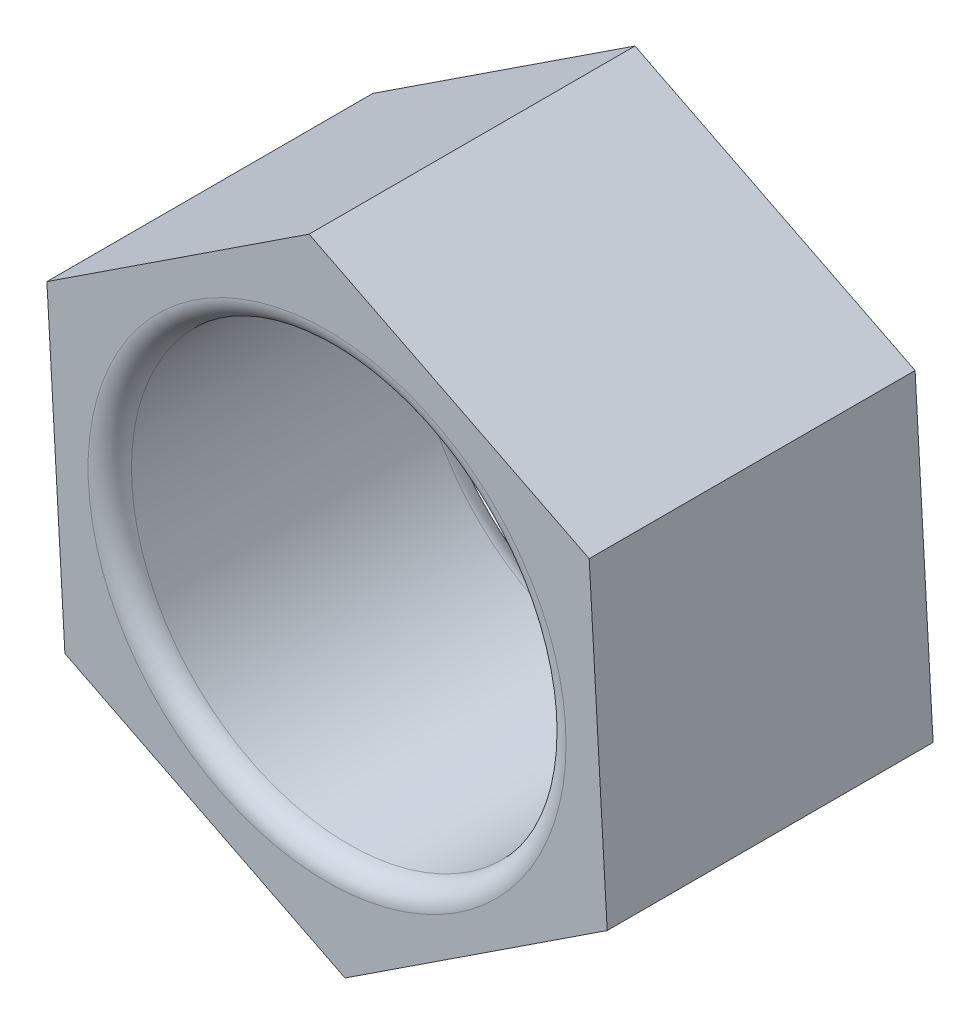
ISO-10303-21;
HEADER;
FILE_DESCRIPTION(('STEP AP214'),'2;1');
FILE_NAME('part.step','',(''),(''),'','','');
FILE_SCHEMA(('AUTOMOTIVE_DESIGN { 1 0 10303 214 1 1 1 1 }'));
ENDSEC;
DATA;
#1=APPLICATION_CONTEXT('core data for automotive mechanical design processes');
#2=APPLICATION_PROTOCOL_DEFINITION('international standard','automotive_design',2000,#1);
#3=PRODUCT_CONTEXT('',#1,'mechanical');
#4=PRODUCT('Part','Part','',(#3));
#5=PRODUCT_RELATED_PRODUCT_CATEGORY('part','',(#4));
#6=PRODUCT_DEFINITION_FORMATION('','',#4);
#7=PRODUCT_DEFINITION_CONTEXT('part definition',#1,'design');
#8=PRODUCT_DEFINITION('design','',#6,#7);
#9=PRODUCT_DEFINITION_SHAPE('','',#8);
#10=(LENGTH_UNIT() NAMED_UNIT(*) SI_UNIT(.MILLI.,.METRE.));
#11=(NAMED_UNIT(*) PLANE_ANGLE_UNIT() SI_UNIT($,.RADIAN.));
#12=(NAMED_UNIT(*) SI_UNIT($,.STERADIAN.) SOLID_ANGLE_UNIT());
#13=UNCERTAINTY_MEASURE_WITH_UNIT(LENGTH_MEASURE(1.E-05),#10,'distance_accuracy_value','');
#14=(GEOMETRIC_REPRESENTATION_CONTEXT(3) GLOBAL_UNCERTAINTY_ASSIGNED_CONTEXT((#13)) GLOBAL_UNIT_ASSIGNED_CONTEXT((#10,
#11,#12)) REPRESENTATION_CONTEXT('',''));
#15=CARTESIAN_POINT('',(0.,0.,0.));
#16=DIRECTION('',(0.,0.,1.));
#17=DIRECTION('',(1.,0.,0.));
#18=AXIS2_PLACEMENT_3D('',#15,#16,#17);
#19=CARTESIAN_POINT('',(1.20650377619789,0.792263826861706,1.5));
#20=DIRECTION('',(-0.449454025494052,-0.893303464096716,0.));
#21=DIRECTION('',(0.893303464096716,-0.449454025494052,0.));
#22=AXIS2_PLACEMENT_3D('',#19,#20,#21);
#23=PLANE('',#22);
#24=DIRECTION('',(-0.893303464096716,0.449454025494052,0.));
#25=VECTOR('',#24,1.);
#26=CARTESIAN_POINT('',(1.20650377619789,0.792263826861706,0.));
#27=LINE('',#26,#25);
#28=CARTESIAN_POINT('',(1.20650377619789,0.792263826861706,0.));
#29=VERTEX_POINT('',#28);
#30=CARTESIAN_POINT('',(-0.0828687124627659,1.44099483338009,0.));
#31=VERTEX_POINT('',#30);
#32=EDGE_CURVE('E120',#29,#31,#27,.T.);
#33=ORIENTED_EDGE('',*,*,#32,.T.);
#34=DIRECTION('',(0.,0.,-1.));
#35=VECTOR('',#34,1.);
#36=CARTESIAN_POINT('',(-0.0828687124627659,1.44099483338009,1.5));
#37=LINE('',#36,#35);
#38=CARTESIAN_POINT('',(-0.0828687124627659,1.44099483338009,1.5));
#39=VERTEX_POINT('',#38);
#40=EDGE_CURVE('E137',#39,#31,#37,.T.);
#41=ORIENTED_EDGE('',*,*,#40,.F.);
#42=DIRECTION('',(-0.893303464096716,0.449454025494052,0.));
#43=VECTOR('',#42,1.);
#44=CARTESIAN_POINT('',(1.20650377619789,0.792263826861706,1.5));
#45=LINE('',#44,#43);
#46=CARTESIAN_POINT('',(1.20650377619789,0.792263826861706,1.5));
#47=VERTEX_POINT('',#46);
#48=EDGE_CURVE('E130',#47,#39,#45,.T.);
#49=ORIENTED_EDGE('',*,*,#48,.F.);
#50=DIRECTION('',(0.,0.,-1.));
#51=VECTOR('',#50,1.);
#52=CARTESIAN_POINT('',(1.20650377619789,0.792263826861706,1.5));
#53=LINE('',#52,#51);
#54=EDGE_CURVE('E116',#47,#29,#53,.T.);
#55=ORIENTED_EDGE('',*,*,#54,.T.);
#56=EDGE_LOOP('',(#33,#41,#49,#55));
#57=FACE_BOUND('',#56,.T.);
#58=ADVANCED_FACE('F34',(#57),#23,.F.);
#59=CARTESIAN_POINT('',(-0.0828687124627659,1.44099483338009,1.5));
#60=DIRECTION('',(0.548896480449371,-0.835890335959385,0.));
#61=DIRECTION('',(0.835890335959385,0.548896480449371,0.));
#62=AXIS2_PLACEMENT_3D('',#59,#60,#61);
#63=PLANE('',#62);
#64=DIRECTION('',(-0.835890335959385,-0.548896480449371,0.));
#65=VECTOR('',#64,1.);
#66=CARTESIAN_POINT('',(-0.0828687124627659,1.44099483338009,0.));
#67=LINE('',#66,#65);
#68=CARTESIAN_POINT('',(-1.28937248866066,0.648731006518379,0.));
#69=VERTEX_POINT('',#68);
#70=EDGE_CURVE('E123',#31,#69,#67,.T.);
#71=ORIENTED_EDGE('',*,*,#70,.T.);
#72=DIRECTION('',(0.,0.,-1.));
#73=VECTOR('',#72,1.);
#74=CARTESIAN_POINT('',(-1.28937248866066,0.648731006518379,1.5));
#75=LINE('',#74,#73);
#76=CARTESIAN_POINT('',(-1.28937248866066,0.648731006518379,1.5));
#77=VERTEX_POINT('',#76);
#78=EDGE_CURVE('E134',#77,#69,#75,.T.);
#79=ORIENTED_EDGE('',*,*,#78,.F.);
#80=DIRECTION('',(-0.835890335959385,-0.548896480449371,0.));
#81=VECTOR('',#80,1.);
#82=CARTESIAN_POINT('',(-0.0828687124627659,1.44099483338009,1.5));
#83=LINE('',#82,#81);
#84=EDGE_CURVE('E89',#39,#77,#83,.T.);
#85=ORIENTED_EDGE('',*,*,#84,.F.);
#86=ORIENTED_EDGE('',*,*,#40,.T.);
#87=EDGE_LOOP('',(#71,#79,#85,#86));
#88=FACE_BOUND('',#87,.T.);
#89=ADVANCED_FACE('F176',(#88),#63,.F.);
#90=CARTESIAN_POINT('',(-1.28937248866066,0.648731006518379,1.5));
#91=DIRECTION('',(0.998350505943422,0.0574131281373304,0.));
#92=DIRECTION('',(-0.0574131281373304,0.998350505943422,0.));
#93=AXIS2_PLACEMENT_3D('',#90,#91,#92);
#94=PLANE('',#93);
#95=DIRECTION('',(0.0574131281373304,-0.998350505943422,0.));
#96=VECTOR('',#95,1.);
#97=CARTESIAN_POINT('',(-1.28937248866066,0.648731006518379,0.));
#98=LINE('',#97,#96);
#99=CARTESIAN_POINT('',(-1.2065037761979,-0.792263826861706,0.));
#100=VERTEX_POINT('',#99);
#101=EDGE_CURVE('E125',#69,#100,#98,.T.);
#102=ORIENTED_EDGE('',*,*,#101,.T.);
#103=DIRECTION('',(0.,0.,-1.));
#104=VECTOR('',#103,1.);
#105=CARTESIAN_POINT('',(-1.2065037761979,-0.792263826861706,1.5));
#106=LINE('',#105,#104);
#107=CARTESIAN_POINT('',(-1.2065037761979,-0.792263826861706,1.5));
#108=VERTEX_POINT('',#107);
#109=EDGE_CURVE('E111',#108,#100,#106,.T.);
#110=ORIENTED_EDGE('',*,*,#109,.F.);
#111=DIRECTION('',(0.0574131281373304,-0.998350505943422,0.));
#112=VECTOR('',#111,1.);
#113=CARTESIAN_POINT('',(-1.28937248866066,0.648731006518379,1.5));
#114=LINE('',#113,#112);
#115=EDGE_CURVE('E102',#77,#108,#114,.T.);
#116=ORIENTED_EDGE('',*,*,#115,.F.);
#117=ORIENTED_EDGE('',*,*,#78,.T.);
#118=EDGE_LOOP('',(#102,#110,#116,#117));
#119=FACE_BOUND('',#118,.T.);
#120=ADVANCED_FACE('F181',(#119),#94,.F.);
#121=CARTESIAN_POINT('',(-1.2065037761979,-0.792263826861706,1.5));
#122=DIRECTION('',(0.449454025494052,0.893303464096716,0.));
#123=DIRECTION('',(-0.893303464096716,0.449454025494052,0.));
#124=AXIS2_PLACEMENT_3D('',#121,#122,#123);
#125=PLANE('',#124);
#126=DIRECTION('',(0.893303464096716,-0.449454025494052,0.));
#127=VECTOR('',#126,1.);
#128=CARTESIAN_POINT('',(-1.2065037761979,-0.792263826861706,0.));
#129=LINE('',#128,#127);
#130=CARTESIAN_POINT('',(0.0828687124627655,-1.44099483338008,0.));
#131=VERTEX_POINT('',#130);
#132=EDGE_CURVE('E110',#100,#131,#129,.T.);
#133=ORIENTED_EDGE('',*,*,#132,.T.);
#134=DIRECTION('',(0.,0.,-1.));
#135=VECTOR('',#134,1.);
#136=CARTESIAN_POINT('',(0.0828687124627655,-1.44099483338008,1.5));
#137=LINE('',#136,#135);
#138=CARTESIAN_POINT('',(0.0828687124627655,-1.44099483338008,1.5));
#139=VERTEX_POINT('',#138);
#140=EDGE_CURVE('E107',#139,#131,#137,.T.);
#141=ORIENTED_EDGE('',*,*,#140,.F.);
#142=DIRECTION('',(0.893303464096716,-0.449454025494052,0.));
#143=VECTOR('',#142,1.);
#144=CARTESIAN_POINT('',(-1.2065037761979,-0.792263826861706,1.5));
#145=LINE('',#144,#143);
#146=EDGE_CURVE('E96',#108,#139,#145,.T.);
#147=ORIENTED_EDGE('',*,*,#146,.F.);
#148=ORIENTED_EDGE('',*,*,#109,.T.);
#149=EDGE_LOOP('',(#133,#141,#147,#148));
#150=FACE_BOUND('',#149,.T.);
#151=ADVANCED_FACE('F108',(#150),#125,.F.);
#152=CARTESIAN_POINT('',(0.0828687124627655,-1.44099483338008,1.5));
#153=DIRECTION('',(-0.54889648044937,0.835890335959385,0.));
#154=DIRECTION('',(-0.835890335959385,-0.54889648044937,0.));
#155=AXIS2_PLACEMENT_3D('',#152,#153,#154);
#156=PLANE('',#155);
#157=DIRECTION('',(0.835890335959385,0.54889648044937,0.));
#158=VECTOR('',#157,1.);
#159=CARTESIAN_POINT('',(0.0828687124627655,-1.44099483338008,0.));
#160=LINE('',#159,#158);
#161=CARTESIAN_POINT('',(1.28937248866066,-0.648731006518379,0.));
#162=VERTEX_POINT('',#161);
#163=EDGE_CURVE('E74',#131,#162,#160,.T.);
#164=ORIENTED_EDGE('',*,*,#163,.T.);
#165=DIRECTION('',(0.,0.,-1.));
#166=VECTOR('',#165,1.);
#167=CARTESIAN_POINT('',(1.28937248866066,-0.648731006518379,1.5));
#168=LINE('',#167,#166);
#169=CARTESIAN_POINT('',(1.28937248866066,-0.648731006518379,1.5));
#170=VERTEX_POINT('',#169);
#171=EDGE_CURVE('E112',#170,#162,#168,.T.);
#172=ORIENTED_EDGE('',*,*,#171,.F.);
#173=DIRECTION('',(0.835890335959385,0.54889648044937,0.));
#174=VECTOR('',#173,1.);
#175=CARTESIAN_POINT('',(0.0828687124627655,-1.44099483338008,1.5));
#176=LINE('',#175,#174);
#177=EDGE_CURVE('E100',#139,#170,#176,.T.);
#178=ORIENTED_EDGE('',*,*,#177,.F.);
#179=ORIENTED_EDGE('',*,*,#140,.T.);
#180=EDGE_LOOP('',(#164,#172,#178,#179));
#181=FACE_BOUND('',#180,.T.);
#182=ADVANCED_FACE('F114',(#181),#156,.F.);
#183=CARTESIAN_POINT('',(1.28937248866066,-0.648731006518379,1.5));
#184=DIRECTION('',(-0.998350505943422,-0.0574131281373302,0.));
#185=DIRECTION('',(0.0574131281373302,-0.998350505943422,0.));
#186=AXIS2_PLACEMENT_3D('',#183,#184,#185);
#187=PLANE('',#186);
#188=DIRECTION('',(-0.0574131281373302,0.998350505943422,0.));
#189=VECTOR('',#188,1.);
#190=CARTESIAN_POINT('',(1.28937248866066,-0.648731006518379,0.));
#191=LINE('',#190,#189);
#192=EDGE_CURVE('E80',#162,#29,#191,.T.);
#193=ORIENTED_EDGE('',*,*,#192,.T.);
#194=ORIENTED_EDGE('',*,*,#54,.F.);
#195=DIRECTION('',(-0.0574131281373302,0.998350505943422,0.));
#196=VECTOR('',#195,1.);
#197=CARTESIAN_POINT('',(1.28937248866066,-0.648731006518379,1.5));
#198=LINE('',#197,#196);
#199=EDGE_CURVE('E51',#170,#47,#198,.T.);
#200=ORIENTED_EDGE('',*,*,#199,.F.);
#201=ORIENTED_EDGE('',*,*,#171,.T.);
#202=EDGE_LOOP('',(#193,#194,#200,#201));
#203=FACE_BOUND('',#202,.T.);
#204=ADVANCED_FACE('F164',(#203),#187,.F.);
#205=CARTESIAN_POINT('',(0.,0.,1.5));
#206=DIRECTION('',(0.,0.,1.));
#207=DIRECTION('',(1.,0.,0.));
#208=AXIS2_PLACEMENT_3D('',#205,#206,#207);
#209=PLANE('',#208);
#210=CARTESIAN_POINT('',(0.,0.,1.5));
#211=DIRECTION('',(0.,0.,1.));
#212=DIRECTION('',(1.,0.,0.));
#213=AXIS2_PLACEMENT_3D('',#210,#211,#212);
#214=CIRCLE('',#213,1.1);
#215=CARTESIAN_POINT('',(1.1,0.,1.5));
#216=VERTEX_POINT('',#215);
#217=EDGE_CURVE('E11',#216,#216,#214,.F.);
#218=ORIENTED_EDGE('',*,*,#217,.T.);
#219=EDGE_LOOP('',(#218));
#220=FACE_BOUND('',#219,.T.);
#221=ORIENTED_EDGE('',*,*,#48,.T.);
#222=ORIENTED_EDGE('',*,*,#84,.T.);
#223=ORIENTED_EDGE('',*,*,#115,.T.);
#224=ORIENTED_EDGE('',*,*,#146,.T.);
#225=ORIENTED_EDGE('',*,*,#177,.T.);
#226=ORIENTED_EDGE('',*,*,#199,.T.);
#227=EDGE_LOOP('',(#221,#222,#223,#224,#225,#226));
#228=FACE_BOUND('',#227,.T.);
#229=ADVANCED_FACE('F98',(#220,#228),#209,.T.);
#230=CARTESIAN_POINT('',(0.,0.,0.));
#231=DIRECTION('',(0.,0.,1.));
#232=DIRECTION('',(1.,0.,0.));
#233=AXIS2_PLACEMENT_3D('',#230,#231,#232);
#234=PLANE('',#233);
#235=CARTESIAN_POINT('',(0.,0.,0.));
#236=DIRECTION('',(0.,0.,1.));
#237=DIRECTION('',(1.,0.,0.));
#238=AXIS2_PLACEMENT_3D('',#235,#236,#237);
#239=CIRCLE('',#238,1.1);
#240=CARTESIAN_POINT('',(1.1,0.,0.));
#241=VERTEX_POINT('',#240);
#242=EDGE_CURVE('E139',#241,#241,#239,.T.);
#243=ORIENTED_EDGE('',*,*,#242,.T.);
#244=EDGE_LOOP('',(#243));
#245=FACE_BOUND('',#244,.T.);
#246=ORIENTED_EDGE('',*,*,#32,.F.);
#247=ORIENTED_EDGE('',*,*,#192,.F.);
#248=ORIENTED_EDGE('',*,*,#163,.F.);
#249=ORIENTED_EDGE('',*,*,#132,.F.);
#250=ORIENTED_EDGE('',*,*,#101,.F.);
#251=ORIENTED_EDGE('',*,*,#70,.F.);
#252=EDGE_LOOP('',(#246,#247,#248,#249,#250,#251));
#253=FACE_BOUND('',#252,.T.);
#254=ADVANCED_FACE('F155',(#245,#253),#234,.F.);
#255=CARTESIAN_POINT('',(0.,0.,0.));
#256=DIRECTION('',(0.,0.,1.));
#257=DIRECTION('',(1.,0.,0.));
#258=AXIS2_PLACEMENT_3D('',#255,#256,#257);
#259=CYLINDRICAL_SURFACE('',#258,1.);
#260=CARTESIAN_POINT('',(0.,0.,0.1));
#261=DIRECTION('',(0.,0.,1.));
#262=DIRECTION('',(1.,0.,0.));
#263=AXIS2_PLACEMENT_3D('',#260,#261,#262);
#264=CIRCLE('',#263,1.);
#265=CARTESIAN_POINT('',(1.,0.,0.1));
#266=VERTEX_POINT('',#265);
#267=EDGE_CURVE('E43',#266,#266,#264,.F.);
#268=ORIENTED_EDGE('',*,*,#267,.T.);
#269=EDGE_LOOP('',(#268));
#270=FACE_BOUND('',#269,.T.);
#271=CARTESIAN_POINT('',(0.,0.,1.4));
#272=DIRECTION('',(0.,0.,1.));
#273=DIRECTION('',(1.,0.,0.));
#274=AXIS2_PLACEMENT_3D('',#271,#272,#273);
#275=CIRCLE('',#274,1.);
#276=CARTESIAN_POINT('',(1.,0.,1.4));
#277=VERTEX_POINT('',#276);
#278=EDGE_CURVE('E142',#277,#277,#275,.T.);
#279=ORIENTED_EDGE('',*,*,#278,.T.);
#280=EDGE_LOOP('',(#279));
#281=FACE_BOUND('',#280,.T.);
#282=ADVANCED_FACE('F147',(#270,#281),#259,.F.);
#283=CARTESIAN_POINT('',(0.,0.,0.1));
#284=DIRECTION('',(0.,0.,1.));
#285=DIRECTION('',(1.,0.,0.));
#286=AXIS2_PLACEMENT_3D('',#283,#284,#285);
#287=TOROIDAL_SURFACE('',#286,1.1,0.1);
#288=ORIENTED_EDGE('',*,*,#267,.F.);
#289=EDGE_LOOP('',(#288));
#290=FACE_BOUND('',#289,.T.);
#291=ORIENTED_EDGE('',*,*,#242,.F.);
#292=EDGE_LOOP('',(#291));
#293=FACE_BOUND('',#292,.T.);
#294=ADVANCED_FACE('F150',(#290,#293),#287,.T.);
#295=CARTESIAN_POINT('',(0.,0.,1.4));
#296=DIRECTION('',(0.,0.,1.));
#297=DIRECTION('',(1.,0.,0.));
#298=AXIS2_PLACEMENT_3D('',#295,#296,#297);
#299=TOROIDAL_SURFACE('',#298,1.1,0.1);
#300=ORIENTED_EDGE('',*,*,#217,.F.);
#301=EDGE_LOOP('',(#300));
#302=FACE_BOUND('',#301,.T.);
#303=ORIENTED_EDGE('',*,*,#278,.F.);
#304=EDGE_LOOP('',(#303));
#305=FACE_BOUND('',#304,.T.);
#306=ADVANCED_FACE('F36',(#302,#305),#299,.T.);
#307=CLOSED_SHELL('',(#58,#89,#120,#151,#182,#204,#229,#254,#282,#294,#306));
#308=MANIFOLD_SOLID_BREP('B2',#307);
#309=ADVANCED_BREP_SHAPE_REPRESENTATION('',(#18,#308),#14);
#310=SHAPE_DEFINITION_REPRESENTATION(#9,#309);
ENDSEC;
END-ISO-10303-21;
